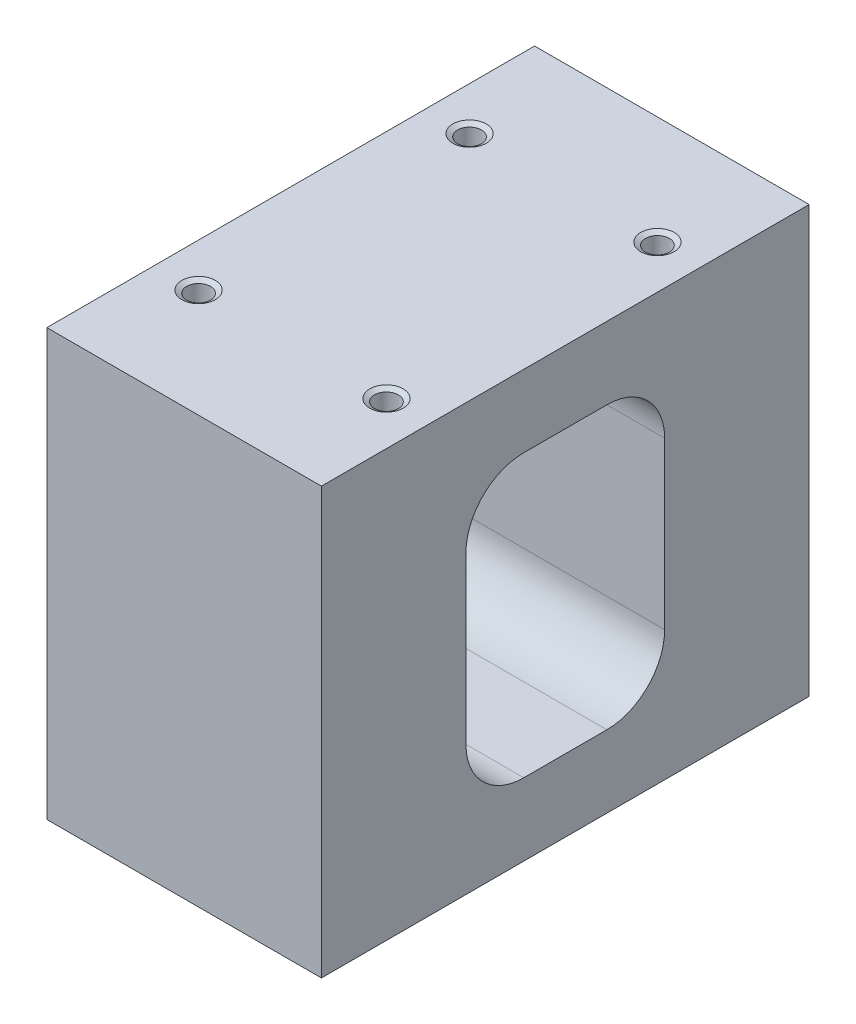
ISO-10303-21;
HEADER;
FILE_DESCRIPTION(('STEP AP214'),'2;1');
FILE_NAME('part.step','',(''),(''),'','','');
FILE_SCHEMA(('AUTOMOTIVE_DESIGN { 1 0 10303 214 1 1 1 1 }'));
ENDSEC;
DATA;
#1=APPLICATION_CONTEXT('core data for automotive mechanical design processes');
#2=APPLICATION_PROTOCOL_DEFINITION('international standard','automotive_design',2000,#1);
#3=PRODUCT_CONTEXT('',#1,'mechanical');
#4=PRODUCT('Part','Part','',(#3));
#5=PRODUCT_RELATED_PRODUCT_CATEGORY('part','',(#4));
#6=PRODUCT_DEFINITION_FORMATION('','',#4);
#7=PRODUCT_DEFINITION_CONTEXT('part definition',#1,'design');
#8=PRODUCT_DEFINITION('design','',#6,#7);
#9=PRODUCT_DEFINITION_SHAPE('','',#8);
#10=(LENGTH_UNIT() NAMED_UNIT(*) SI_UNIT(.MILLI.,.METRE.));
#11=(NAMED_UNIT(*) PLANE_ANGLE_UNIT() SI_UNIT($,.RADIAN.));
#12=(NAMED_UNIT(*) SI_UNIT($,.STERADIAN.) SOLID_ANGLE_UNIT());
#13=UNCERTAINTY_MEASURE_WITH_UNIT(LENGTH_MEASURE(1.E-05),#10,'distance_accuracy_value','');
#14=(GEOMETRIC_REPRESENTATION_CONTEXT(3) GLOBAL_UNCERTAINTY_ASSIGNED_CONTEXT((#13)) GLOBAL_UNIT_ASSIGNED_CONTEXT((#10,
#11,#12)) REPRESENTATION_CONTEXT('',''));
#15=CARTESIAN_POINT('',(0.,0.,0.));
#16=DIRECTION('',(0.,0.,1.));
#17=DIRECTION('',(1.,0.,0.));
#18=AXIS2_PLACEMENT_3D('',#15,#16,#17);
#19=CARTESIAN_POINT('',(228.51065,-329.239072168889,-602.3375));
#20=DIRECTION('',(0.,1.,0.));
#21=DIRECTION('',(0.,0.,1.));
#22=AXIS2_PLACEMENT_3D('',#19,#20,#21);
#23=CONICAL_SURFACE('',#22,1.64999999990248,1.02974425868107);
#24=CARTESIAN_POINT('',(228.51064999989,-330.230492190253,-602.3375));
#25=VERTEX_POINT('',#24);
#26=VERTEX_LOOP('',#25);
#27=FACE_BOUND('',#26,.T.);
#28=CARTESIAN_POINT('',(228.51065,-329.239072168843,-602.3375));
#29=DIRECTION('',(0.,1.,0.));
#30=DIRECTION('',(0.,0.,1.));
#31=AXIS2_PLACEMENT_3D('',#28,#29,#30);
#32=CIRCLE('',#31,1.65);
#33=CARTESIAN_POINT('',(228.51065,-329.239072168843,-600.6875));
#34=VERTEX_POINT('',#33);
#35=EDGE_CURVE('E233',#34,#34,#32,.T.);
#36=ORIENTED_EDGE('',*,*,#35,.T.);
#37=EDGE_LOOP('',(#36));
#38=FACE_BOUND('',#37,.T.);
#39=ADVANCED_FACE('F17',(#27,#38),#23,.F.);
#40=CARTESIAN_POINT('',(254.510652388512,-329.239072168832,-639.8375));
#41=DIRECTION('',(0.,1.,0.));
#42=DIRECTION('',(0.,0.,1.));
#43=AXIS2_PLACEMENT_3D('',#40,#41,#42);
#44=CONICAL_SURFACE('',#43,1.65000000001825,1.02974425864892);
#45=CARTESIAN_POINT('',(254.510652388518,-330.230492190196,-639.8375));
#46=VERTEX_POINT('',#45);
#47=VERTEX_LOOP('',#46);
#48=FACE_BOUND('',#47,.T.);
#49=CARTESIAN_POINT('',(254.510652388512,-329.239072168843,-639.8375));
#50=DIRECTION('',(0.,1.,0.));
#51=DIRECTION('',(0.,0.,1.));
#52=AXIS2_PLACEMENT_3D('',#49,#50,#51);
#53=CIRCLE('',#52,1.65);
#54=CARTESIAN_POINT('',(254.510652388512,-329.239072168843,-638.1875));
#55=VERTEX_POINT('',#54);
#56=EDGE_CURVE('E229',#55,#55,#53,.T.);
#57=ORIENTED_EDGE('',*,*,#56,.T.);
#58=EDGE_LOOP('',(#57));
#59=FACE_BOUND('',#58,.T.);
#60=ADVANCED_FACE('F521',(#48,#59),#44,.F.);
#61=CARTESIAN_POINT('',(254.51065,-329.239072168832,-602.3375));
#62=DIRECTION('',(0.,1.,0.));
#63=DIRECTION('',(0.,0.,1.));
#64=AXIS2_PLACEMENT_3D('',#61,#62,#63);
#65=CONICAL_SURFACE('',#64,1.65000000008347,1.02974425870138);
#66=CARTESIAN_POINT('',(254.510649999929,-330.230492190225,-602.3375));
#67=VERTEX_POINT('',#66);
#68=VERTEX_LOOP('',#67);
#69=FACE_BOUND('',#68,.T.);
#70=CARTESIAN_POINT('',(254.51065,-329.239072168843,-602.3375));
#71=DIRECTION('',(0.,1.,0.));
#72=DIRECTION('',(0.,0.,1.));
#73=AXIS2_PLACEMENT_3D('',#70,#71,#72);
#74=CIRCLE('',#73,1.65);
#75=CARTESIAN_POINT('',(254.51065,-329.239072168843,-600.6875));
#76=VERTEX_POINT('',#75);
#77=EDGE_CURVE('E225',#76,#76,#74,.T.);
#78=ORIENTED_EDGE('',*,*,#77,.T.);
#79=EDGE_LOOP('',(#78));
#80=FACE_BOUND('',#79,.T.);
#81=ADVANCED_FACE('F518',(#69,#80),#65,.F.);
#82=CARTESIAN_POINT('',(228.510652388512,-329.239072168889,-639.8375));
#83=DIRECTION('',(0.,1.,0.));
#84=DIRECTION('',(0.,0.,1.));
#85=AXIS2_PLACEMENT_3D('',#82,#83,#84);
#86=CONICAL_SURFACE('',#85,1.64999999995094,1.02974425857238);
#87=CARTESIAN_POINT('',(228.510652388394,-330.23049219031,-639.8375));
#88=VERTEX_POINT('',#87);
#89=VERTEX_LOOP('',#88);
#90=FACE_BOUND('',#89,.T.);
#91=CARTESIAN_POINT('',(228.510652388512,-329.239072168843,-639.8375));
#92=DIRECTION('',(0.,1.,0.));
#93=DIRECTION('',(0.,0.,1.));
#94=AXIS2_PLACEMENT_3D('',#91,#92,#93);
#95=CIRCLE('',#94,1.65);
#96=CARTESIAN_POINT('',(228.510652388512,-329.239072168843,-638.1875));
#97=VERTEX_POINT('',#96);
#98=EDGE_CURVE('E221',#97,#97,#95,.T.);
#99=ORIENTED_EDGE('',*,*,#98,.T.);
#100=EDGE_LOOP('',(#99));
#101=FACE_BOUND('',#100,.T.);
#102=ADVANCED_FACE('F514',(#90,#101),#86,.F.);
#103=CARTESIAN_POINT('',(228.510652388512,-363.7890721688,-602.3375));
#104=DIRECTION('',(0.,-1.,0.));
#105=DIRECTION('',(0.,0.,-1.));
#106=AXIS2_PLACEMENT_3D('',#103,#104,#105);
#107=CONICAL_SURFACE('',#106,1.64999999984597,1.02974425857194);
#108=CARTESIAN_POINT('',(228.510652388621,-362.797652147435,-602.3375));
#109=VERTEX_POINT('',#108);
#110=VERTEX_LOOP('',#109);
#111=FACE_BOUND('',#110,.T.);
#112=CARTESIAN_POINT('',(228.510652388512,-363.789072168843,-602.3375));
#113=DIRECTION('',(0.,-1.,0.));
#114=DIRECTION('',(0.,0.,-1.));
#115=AXIS2_PLACEMENT_3D('',#112,#113,#114);
#116=CIRCLE('',#115,1.65);
#117=CARTESIAN_POINT('',(228.510652388512,-363.789072168843,-603.9875));
#118=VERTEX_POINT('',#117);
#119=EDGE_CURVE('E217',#118,#118,#116,.T.);
#120=ORIENTED_EDGE('',*,*,#119,.T.);
#121=EDGE_LOOP('',(#120));
#122=FACE_BOUND('',#121,.T.);
#123=ADVANCED_FACE('F507',(#111,#122),#107,.F.);
#124=CARTESIAN_POINT('',(228.510652388512,-363.7890721688,-639.8375));
#125=DIRECTION('',(0.,-1.,0.));
#126=DIRECTION('',(0.,0.,-1.));
#127=AXIS2_PLACEMENT_3D('',#124,#125,#126);
#128=CONICAL_SURFACE('',#127,1.64999999984597,1.02974425857194);
#129=CARTESIAN_POINT('',(228.510652388621,-362.797652147435,-639.8375));
#130=VERTEX_POINT('',#129);
#131=VERTEX_LOOP('',#130);
#132=FACE_BOUND('',#131,.T.);
#133=CARTESIAN_POINT('',(228.510652388512,-363.789072168843,-639.8375));
#134=DIRECTION('',(0.,-1.,0.));
#135=DIRECTION('',(0.,0.,-1.));
#136=AXIS2_PLACEMENT_3D('',#133,#134,#135);
#137=CIRCLE('',#136,1.65);
#138=CARTESIAN_POINT('',(228.510652388512,-363.789072168843,-641.4875));
#139=VERTEX_POINT('',#138);
#140=EDGE_CURVE('E213',#139,#139,#137,.T.);
#141=ORIENTED_EDGE('',*,*,#140,.T.);
#142=EDGE_LOOP('',(#141));
#143=FACE_BOUND('',#142,.T.);
#144=ADVANCED_FACE('F498',(#132,#143),#128,.F.);
#145=CARTESIAN_POINT('',(254.510652388512,-363.789072168856,-602.3375));
#146=DIRECTION('',(0.,-1.,0.));
#147=DIRECTION('',(0.,0.,-1.));
#148=AXIS2_PLACEMENT_3D('',#145,#146,#147);
#149=CONICAL_SURFACE('',#148,1.64999999994919,1.02974425865575);
#150=CARTESIAN_POINT('',(254.510652388575,-362.797652147464,-602.3375));
#151=VERTEX_POINT('',#150);
#152=VERTEX_LOOP('',#151);
#153=FACE_BOUND('',#152,.T.);
#154=CARTESIAN_POINT('',(254.510652388512,-363.789072168843,-602.3375));
#155=DIRECTION('',(0.,-1.,0.));
#156=DIRECTION('',(0.,0.,-1.));
#157=AXIS2_PLACEMENT_3D('',#154,#155,#156);
#158=CIRCLE('',#157,1.65);
#159=CARTESIAN_POINT('',(254.510652388512,-363.789072168843,-603.9875));
#160=VERTEX_POINT('',#159);
#161=EDGE_CURVE('E209',#160,#160,#158,.T.);
#162=ORIENTED_EDGE('',*,*,#161,.T.);
#163=EDGE_LOOP('',(#162));
#164=FACE_BOUND('',#163,.T.);
#165=ADVANCED_FACE('F495',(#153,#164),#149,.F.);
#166=CARTESIAN_POINT('',(254.510652388512,-363.789072168856,-639.8375));
#167=DIRECTION('',(0.,-1.,0.));
#168=DIRECTION('',(0.,0.,-1.));
#169=AXIS2_PLACEMENT_3D('',#166,#167,#168);
#170=CONICAL_SURFACE('',#169,1.64999999994919,1.02974425865575);
#171=CARTESIAN_POINT('',(254.510652388575,-362.797652147464,-639.8375));
#172=VERTEX_POINT('',#171);
#173=VERTEX_LOOP('',#172);
#174=FACE_BOUND('',#173,.T.);
#175=CARTESIAN_POINT('',(254.510652388512,-363.789072168843,-639.8375));
#176=DIRECTION('',(0.,-1.,0.));
#177=DIRECTION('',(0.,0.,-1.));
#178=AXIS2_PLACEMENT_3D('',#175,#176,#177);
#179=CIRCLE('',#178,1.65);
#180=CARTESIAN_POINT('',(254.510652388512,-363.789072168843,-641.4875));
#181=VERTEX_POINT('',#180);
#182=EDGE_CURVE('E205',#181,#181,#179,.T.);
#183=ORIENTED_EDGE('',*,*,#182,.T.);
#184=EDGE_LOOP('',(#183));
#185=FACE_BOUND('',#184,.T.);
#186=ADVANCED_FACE('F497',(#174,#185),#170,.F.);
#187=CARTESIAN_POINT('',(228.51065,-317.039072168843,-602.3375));
#188=DIRECTION('',(0.,1.,0.));
#189=DIRECTION('',(0.,0.,1.));
#190=AXIS2_PLACEMENT_3D('',#187,#188,#189);
#191=CYLINDRICAL_SURFACE('',#190,1.65);
#192=ORIENTED_EDGE('',*,*,#35,.F.);
#193=EDGE_LOOP('',(#192));
#194=FACE_BOUND('',#193,.T.);
#195=CARTESIAN_POINT('',(228.51065,-317.423010097855,-602.3375));
#196=DIRECTION('',(0.,1.,0.));
#197=DIRECTION('',(1.,0.,0.));
#198=AXIS2_PLACEMENT_3D('',#195,#196,#197);
#199=CIRCLE('',#198,1.64999999995932);
#200=CARTESIAN_POINT('',(230.160649999959,-317.423010097855,-602.3375));
#201=VERTEX_POINT('',#200);
#202=EDGE_CURVE('E201',#201,#201,#199,.T.);
#203=ORIENTED_EDGE('',*,*,#202,.T.);
#204=EDGE_LOOP('',(#203));
#205=FACE_BOUND('',#204,.T.);
#206=ADVANCED_FACE('F504',(#194,#205),#191,.F.);
#207=CARTESIAN_POINT('',(254.510652388512,-317.039072168843,-639.8375));
#208=DIRECTION('',(0.,1.,0.));
#209=DIRECTION('',(0.,0.,1.));
#210=AXIS2_PLACEMENT_3D('',#207,#208,#209);
#211=CYLINDRICAL_SURFACE('',#210,1.65);
#212=ORIENTED_EDGE('',*,*,#56,.F.);
#213=EDGE_LOOP('',(#212));
#214=FACE_BOUND('',#213,.T.);
#215=CARTESIAN_POINT('',(254.510652388512,-317.423010097912,-639.8375));
#216=DIRECTION('',(0.,1.,0.));
#217=DIRECTION('',(1.,0.,0.));
#218=AXIS2_PLACEMENT_3D('',#215,#216,#217);
#219=CIRCLE('',#218,1.65000000001825);
#220=CARTESIAN_POINT('',(256.16065238853,-317.423010097912,-639.8375));
#221=VERTEX_POINT('',#220);
#222=EDGE_CURVE('E198',#221,#221,#219,.T.);
#223=ORIENTED_EDGE('',*,*,#222,.T.);
#224=EDGE_LOOP('',(#223));
#225=FACE_BOUND('',#224,.T.);
#226=ADVANCED_FACE('F531',(#214,#225),#211,.F.);
#227=CARTESIAN_POINT('',(254.51065,-317.039072168843,-602.3375));
#228=DIRECTION('',(0.,1.,0.));
#229=DIRECTION('',(0.,0.,1.));
#230=AXIS2_PLACEMENT_3D('',#227,#228,#229);
#231=CYLINDRICAL_SURFACE('',#230,1.65);
#232=ORIENTED_EDGE('',*,*,#77,.F.);
#233=EDGE_LOOP('',(#232));
#234=FACE_BOUND('',#233,.T.);
#235=CARTESIAN_POINT('',(254.51065,-317.423010097912,-602.3375));
#236=DIRECTION('',(0.,1.,0.));
#237=DIRECTION('',(1.,0.,0.));
#238=AXIS2_PLACEMENT_3D('',#235,#236,#237);
#239=CIRCLE('',#238,1.64999999996979);
#240=CARTESIAN_POINT('',(256.16064999997,-317.423010097912,-602.3375));
#241=VERTEX_POINT('',#240);
#242=EDGE_CURVE('E194',#241,#241,#239,.T.);
#243=ORIENTED_EDGE('',*,*,#242,.T.);
#244=EDGE_LOOP('',(#243));
#245=FACE_BOUND('',#244,.T.);
#246=ADVANCED_FACE('F419',(#234,#245),#231,.F.);
#247=CARTESIAN_POINT('',(228.510652388512,-317.039072168843,-639.8375));
#248=DIRECTION('',(0.,1.,0.));
#249=DIRECTION('',(0.,0.,1.));
#250=AXIS2_PLACEMENT_3D('',#247,#248,#249);
#251=CYLINDRICAL_SURFACE('',#250,1.65);
#252=ORIENTED_EDGE('',*,*,#98,.F.);
#253=EDGE_LOOP('',(#252));
#254=FACE_BOUND('',#253,.T.);
#255=CARTESIAN_POINT('',(228.510652388512,-317.423010097855,-639.8375));
#256=DIRECTION('',(0.,1.,0.));
#257=DIRECTION('',(1.,0.,0.));
#258=AXIS2_PLACEMENT_3D('',#255,#256,#257);
#259=CIRCLE('',#258,1.65000000000778);
#260=CARTESIAN_POINT('',(230.16065238852,-317.423010097855,-639.8375));
#261=VERTEX_POINT('',#260);
#262=EDGE_CURVE('E190',#261,#261,#259,.T.);
#263=ORIENTED_EDGE('',*,*,#262,.T.);
#264=EDGE_LOOP('',(#263));
#265=FACE_BOUND('',#264,.T.);
#266=ADVANCED_FACE('F409',(#254,#265),#251,.F.);
#267=CARTESIAN_POINT('',(228.510652388512,-375.989072168843,-602.3375));
#268=DIRECTION('',(0.,-1.,0.));
#269=DIRECTION('',(0.,0.,-1.));
#270=AXIS2_PLACEMENT_3D('',#267,#268,#269);
#271=CYLINDRICAL_SURFACE('',#270,1.65);
#272=ORIENTED_EDGE('',*,*,#119,.F.);
#273=EDGE_LOOP('',(#272));
#274=FACE_BOUND('',#273,.T.);
#275=CARTESIAN_POINT('',(228.510652388512,-375.605134239834,-602.3375));
#276=DIRECTION('',(0.,-1.,0.));
#277=DIRECTION('',(-1.,0.,0.));
#278=AXIS2_PLACEMENT_3D('',#275,#276,#277);
#279=CIRCLE('',#278,1.6500000000165);
#280=CARTESIAN_POINT('',(226.860652388496,-375.605134239834,-602.3375));
#281=VERTEX_POINT('',#280);
#282=EDGE_CURVE('E186',#281,#281,#279,.T.);
#283=ORIENTED_EDGE('',*,*,#282,.T.);
#284=EDGE_LOOP('',(#283));
#285=FACE_BOUND('',#284,.T.);
#286=ADVANCED_FACE('F406',(#274,#285),#271,.F.);
#287=CARTESIAN_POINT('',(228.510652388512,-375.989072168843,-639.8375));
#288=DIRECTION('',(0.,-1.,0.));
#289=DIRECTION('',(0.,0.,-1.));
#290=AXIS2_PLACEMENT_3D('',#287,#288,#289);
#291=CYLINDRICAL_SURFACE('',#290,1.65);
#292=ORIENTED_EDGE('',*,*,#140,.F.);
#293=EDGE_LOOP('',(#292));
#294=FACE_BOUND('',#293,.T.);
#295=CARTESIAN_POINT('',(228.510652388512,-375.605134239834,-639.8375));
#296=DIRECTION('',(0.,-1.,0.));
#297=DIRECTION('',(-1.,0.,0.));
#298=AXIS2_PLACEMENT_3D('',#295,#296,#297);
#299=CIRCLE('',#298,1.6500000000165);
#300=CARTESIAN_POINT('',(226.860652388496,-375.605134239834,-639.8375));
#301=VERTEX_POINT('',#300);
#302=EDGE_CURVE('E182',#301,#301,#299,.T.);
#303=ORIENTED_EDGE('',*,*,#302,.T.);
#304=EDGE_LOOP('',(#303));
#305=FACE_BOUND('',#304,.T.);
#306=ADVANCED_FACE('F408',(#294,#305),#291,.F.);
#307=CARTESIAN_POINT('',(254.510652388512,-375.989072168843,-602.3375));
#308=DIRECTION('',(0.,-1.,0.));
#309=DIRECTION('',(0.,0.,-1.));
#310=AXIS2_PLACEMENT_3D('',#307,#308,#309);
#311=CYLINDRICAL_SURFACE('',#310,1.65);
#312=ORIENTED_EDGE('',*,*,#161,.F.);
#313=EDGE_LOOP('',(#312));
#314=FACE_BOUND('',#313,.T.);
#315=CARTESIAN_POINT('',(254.510652388512,-375.605134239834,-602.3375));
#316=DIRECTION('',(0.,-1.,0.));
#317=DIRECTION('',(-1.,0.,0.));
#318=AXIS2_PLACEMENT_3D('',#315,#316,#317);
#319=CIRCLE('',#318,1.65000000006288);
#320=CARTESIAN_POINT('',(252.860652388449,-375.605134239834,-602.3375));
#321=VERTEX_POINT('',#320);
#322=EDGE_CURVE('E178',#321,#321,#319,.T.);
#323=ORIENTED_EDGE('',*,*,#322,.T.);
#324=EDGE_LOOP('',(#323));
#325=FACE_BOUND('',#324,.T.);
#326=ADVANCED_FACE('F416',(#314,#325),#311,.F.);
#327=CARTESIAN_POINT('',(254.510652388512,-375.989072168843,-639.8375));
#328=DIRECTION('',(0.,-1.,0.));
#329=DIRECTION('',(0.,0.,-1.));
#330=AXIS2_PLACEMENT_3D('',#327,#328,#329);
#331=CYLINDRICAL_SURFACE('',#330,1.65);
#332=ORIENTED_EDGE('',*,*,#182,.F.);
#333=EDGE_LOOP('',(#332));
#334=FACE_BOUND('',#333,.T.);
#335=CARTESIAN_POINT('',(254.510652388512,-375.605134239834,-639.8375));
#336=DIRECTION('',(0.,-1.,0.));
#337=DIRECTION('',(-1.,0.,0.));
#338=AXIS2_PLACEMENT_3D('',#335,#336,#337);
#339=CIRCLE('',#338,1.65000000006288);
#340=CARTESIAN_POINT('',(252.860652388449,-375.605134239834,-639.8375));
#341=VERTEX_POINT('',#340);
#342=EDGE_CURVE('E147',#341,#341,#339,.T.);
#343=ORIENTED_EDGE('',*,*,#342,.T.);
#344=EDGE_LOOP('',(#343));
#345=FACE_BOUND('',#344,.T.);
#346=ADVANCED_FACE('F482',(#334,#345),#331,.F.);
#347=CARTESIAN_POINT('',(228.51065,-317.039072168882,-602.3375));
#348=DIRECTION('',(0.,1.,0.));
#349=DIRECTION('',(0.,0.,1.));
#350=AXIS2_PLACEMENT_3D('',#347,#348,#349);
#351=CONICAL_SURFACE('',#350,2.31499999987197,1.04719755119266);
#352=CARTESIAN_POINT('',(228.51065,-317.039072168802,-602.3375));
#353=DIRECTION('',(0.,1.,0.));
#354=DIRECTION('',(0.,0.,1.));
#355=AXIS2_PLACEMENT_3D('',#352,#353,#354);
#356=CIRCLE('',#355,2.31500000001006);
#357=CARTESIAN_POINT('',(228.51065,-317.039072168802,-600.02249999999));
#358=VERTEX_POINT('',#357);
#359=EDGE_CURVE('E287',#358,#358,#356,.T.);
#360=ORIENTED_EDGE('',*,*,#359,.T.);
#361=EDGE_LOOP('',(#360));
#362=FACE_BOUND('',#361,.T.);
#363=ORIENTED_EDGE('',*,*,#202,.F.);
#364=EDGE_LOOP('',(#363));
#365=FACE_BOUND('',#364,.T.);
#366=ADVANCED_FACE('F478',(#362,#365),#351,.F.);
#367=CARTESIAN_POINT('',(254.510652388512,-317.039072168882,-639.8375));
#368=DIRECTION('',(0.,1.,0.));
#369=DIRECTION('',(0.,0.,1.));
#370=AXIS2_PLACEMENT_3D('',#367,#368,#369);
#371=CONICAL_SURFACE('',#370,2.31500000004459,1.04719755119266);
#372=CARTESIAN_POINT('',(254.510652388512,-317.039072168869,-639.8375));
#373=DIRECTION('',(0.,1.,0.));
#374=DIRECTION('',(0.,0.,1.));
#375=AXIS2_PLACEMENT_3D('',#372,#373,#374);
#376=CIRCLE('',#375,2.3150000000669);
#377=CARTESIAN_POINT('',(254.510652388512,-317.039072168869,-637.522499999933));
#378=VERTEX_POINT('',#377);
#379=EDGE_CURVE('E283',#378,#378,#376,.T.);
#380=ORIENTED_EDGE('',*,*,#379,.T.);
#381=EDGE_LOOP('',(#380));
#382=FACE_BOUND('',#381,.T.);
#383=ORIENTED_EDGE('',*,*,#222,.F.);
#384=EDGE_LOOP('',(#383));
#385=FACE_BOUND('',#384,.T.);
#386=ADVANCED_FACE('F474',(#382,#385),#371,.F.);
#387=CARTESIAN_POINT('',(254.51065,-317.039072168882,-602.3375));
#388=DIRECTION('',(0.,1.,0.));
#389=DIRECTION('',(0.,0.,1.));
#390=AXIS2_PLACEMENT_3D('',#387,#388,#389);
#391=CONICAL_SURFACE('',#390,2.31499999999613,1.04719755119266);
#392=CARTESIAN_POINT('',(254.51065,-317.039072168874,-602.3375));
#393=DIRECTION('',(0.,1.,0.));
#394=DIRECTION('',(0.,0.,1.));
#395=AXIS2_PLACEMENT_3D('',#392,#393,#394);
#396=CIRCLE('',#395,2.31500000001006);
#397=CARTESIAN_POINT('',(254.51065,-317.039072168874,-600.02249999999));
#398=VERTEX_POINT('',#397);
#399=EDGE_CURVE('E279',#398,#398,#396,.T.);
#400=ORIENTED_EDGE('',*,*,#399,.T.);
#401=EDGE_LOOP('',(#400));
#402=FACE_BOUND('',#401,.T.);
#403=ORIENTED_EDGE('',*,*,#242,.F.);
#404=EDGE_LOOP('',(#403));
#405=FACE_BOUND('',#404,.T.);
#406=ADVANCED_FACE('F470',(#402,#405),#391,.F.);
#407=CARTESIAN_POINT('',(228.510652388512,-317.039072168882,-639.8375));
#408=DIRECTION('',(0.,1.,0.));
#409=DIRECTION('',(0.,0.,1.));
#410=AXIS2_PLACEMENT_3D('',#407,#408,#409);
#411=CONICAL_SURFACE('',#410,2.31499999997728,1.04719755119266);
#412=CARTESIAN_POINT('',(228.510652388512,-317.03907216883,-639.8375));
#413=DIRECTION('',(0.,1.,0.));
#414=DIRECTION('',(0.,0.,1.));
#415=AXIS2_PLACEMENT_3D('',#412,#413,#414);
#416=CIRCLE('',#415,2.3150000000669);
#417=CARTESIAN_POINT('',(228.510652388512,-317.03907216883,-637.522499999933));
#418=VERTEX_POINT('',#417);
#419=EDGE_CURVE('E274',#418,#418,#416,.T.);
#420=ORIENTED_EDGE('',*,*,#419,.T.);
#421=EDGE_LOOP('',(#420));
#422=FACE_BOUND('',#421,.T.);
#423=ORIENTED_EDGE('',*,*,#262,.F.);
#424=EDGE_LOOP('',(#423));
#425=FACE_BOUND('',#424,.T.);
#426=ADVANCED_FACE('F402',(#422,#425),#411,.F.);
#427=CARTESIAN_POINT('',(228.510652388512,-375.98907216875,-602.3375));
#428=DIRECTION('',(0.,-1.,0.));
#429=DIRECTION('',(0.,0.,-1.));
#430=AXIS2_PLACEMENT_3D('',#427,#428,#429);
#431=CONICAL_SURFACE('',#430,2.31499999987231,1.04719755121976);
#432=CARTESIAN_POINT('',(228.510652388512,-375.989072168796,-602.3375));
#433=DIRECTION('',(0.,-1.,0.));
#434=DIRECTION('',(0.,0.,-1.));
#435=AXIS2_PLACEMENT_3D('',#432,#433,#434);
#436=CIRCLE('',#435,2.31499999995322);
#437=CARTESIAN_POINT('',(228.510652388512,-375.989072168796,-604.652499999953));
#438=VERTEX_POINT('',#437);
#439=EDGE_CURVE('E269',#438,#438,#436,.T.);
#440=ORIENTED_EDGE('',*,*,#439,.T.);
#441=EDGE_LOOP('',(#440));
#442=FACE_BOUND('',#441,.T.);
#443=ORIENTED_EDGE('',*,*,#282,.F.);
#444=EDGE_LOOP('',(#443));
#445=FACE_BOUND('',#444,.T.);
#446=ADVANCED_FACE('F398',(#442,#445),#431,.F.);
#447=CARTESIAN_POINT('',(228.510652388512,-375.98907216875,-639.8375));
#448=DIRECTION('',(0.,-1.,0.));
#449=DIRECTION('',(0.,0.,-1.));
#450=AXIS2_PLACEMENT_3D('',#447,#448,#449);
#451=CONICAL_SURFACE('',#450,2.31499999987231,1.04719755121976);
#452=CARTESIAN_POINT('',(228.510652388512,-375.989072168796,-639.8375));
#453=DIRECTION('',(0.,-1.,0.));
#454=DIRECTION('',(0.,0.,-1.));
#455=AXIS2_PLACEMENT_3D('',#452,#453,#454);
#456=CIRCLE('',#455,2.31499999995322);
#457=CARTESIAN_POINT('',(228.510652388512,-375.989072168796,-642.152499999953));
#458=VERTEX_POINT('',#457);
#459=EDGE_CURVE('E265',#458,#458,#456,.T.);
#460=ORIENTED_EDGE('',*,*,#459,.T.);
#461=EDGE_LOOP('',(#460));
#462=FACE_BOUND('',#461,.T.);
#463=ORIENTED_EDGE('',*,*,#302,.F.);
#464=EDGE_LOOP('',(#463));
#465=FACE_BOUND('',#464,.T.);
#466=ADVANCED_FACE('F401',(#462,#465),#451,.F.);
#467=CARTESIAN_POINT('',(254.510652388512,-375.989072168807,-602.3375));
#468=DIRECTION('',(0.,-1.,0.));
#469=DIRECTION('',(0.,0.,-1.));
#470=AXIS2_PLACEMENT_3D('',#467,#468,#469);
#471=CONICAL_SURFACE('',#470,2.31499999997553,1.04719755118274);
#472=CARTESIAN_POINT('',(254.510652388512,-375.989072168794,-602.3375));
#473=DIRECTION('',(0.,-1.,0.));
#474=DIRECTION('',(0.,0.,-1.));
#475=AXIS2_PLACEMENT_3D('',#472,#473,#474);
#476=CIRCLE('',#475,2.31499999995322);
#477=CARTESIAN_POINT('',(254.510652388512,-375.989072168794,-604.652499999953));
#478=VERTEX_POINT('',#477);
#479=EDGE_CURVE('E261',#478,#478,#476,.T.);
#480=ORIENTED_EDGE('',*,*,#479,.T.);
#481=EDGE_LOOP('',(#480));
#482=FACE_BOUND('',#481,.T.);
#483=ORIENTED_EDGE('',*,*,#322,.F.);
#484=EDGE_LOOP('',(#483));
#485=FACE_BOUND('',#484,.T.);
#486=ADVANCED_FACE('F460',(#482,#485),#471,.F.);
#487=CARTESIAN_POINT('',(254.510652388512,-375.989072168807,-639.8375));
#488=DIRECTION('',(0.,-1.,0.));
#489=DIRECTION('',(0.,0.,-1.));
#490=AXIS2_PLACEMENT_3D('',#487,#488,#489);
#491=CONICAL_SURFACE('',#490,2.31499999997553,1.04719755118274);
#492=CARTESIAN_POINT('',(254.510652388512,-375.989072168794,-639.8375));
#493=DIRECTION('',(0.,-1.,0.));
#494=DIRECTION('',(0.,0.,-1.));
#495=AXIS2_PLACEMENT_3D('',#492,#493,#494);
#496=CIRCLE('',#495,2.31499999995322);
#497=CARTESIAN_POINT('',(254.510652388512,-375.989072168794,-642.152499999953));
#498=VERTEX_POINT('',#497);
#499=EDGE_CURVE('E256',#498,#498,#496,.T.);
#500=ORIENTED_EDGE('',*,*,#499,.T.);
#501=EDGE_LOOP('',(#500));
#502=FACE_BOUND('',#501,.T.);
#503=ORIENTED_EDGE('',*,*,#342,.F.);
#504=EDGE_LOOP('',(#503));
#505=FACE_BOUND('',#504,.T.);
#506=ADVANCED_FACE('F457',(#502,#505),#491,.F.);
#507=CARTESIAN_POINT('',(260.510652388512,-414.989072168843,-634.8375));
#508=DIRECTION('',(-1.,0.,0.));
#509=DIRECTION('',(0.,0.,1.));
#510=AXIS2_PLACEMENT_3D('',#507,#508,#509);
#511=PLANE('',#510);
#512=DIRECTION('',(0.,1.,0.));
#513=VECTOR('',#512,1.);
#514=CARTESIAN_POINT('',(260.510652388512,-375.989072168843,-654.8375));
#515=LINE('',#514,#513);
#516=CARTESIAN_POINT('',(260.510652388512,-375.989072168843,-654.8375));
#517=VERTEX_POINT('',#516);
#518=CARTESIAN_POINT('',(260.510652388512,-317.039072168843,-654.8375));
#519=VERTEX_POINT('',#518);
#520=EDGE_CURVE('E331',#517,#519,#515,.T.);
#521=ORIENTED_EDGE('',*,*,#520,.T.);
#522=DIRECTION('',(0.,0.,-1.));
#523=VECTOR('',#522,1.);
#524=CARTESIAN_POINT('',(260.510652388512,-317.039072168843,-654.8375));
#525=LINE('',#524,#523);
#526=CARTESIAN_POINT('',(260.510652388512,-317.039072168843,-587.3375));
#527=VERTEX_POINT('',#526);
#528=EDGE_CURVE('E278',#519,#527,#525,.F.);
#529=ORIENTED_EDGE('',*,*,#528,.T.);
#530=DIRECTION('',(0.,1.,0.));
#531=VECTOR('',#530,1.);
#532=CARTESIAN_POINT('',(260.510652388512,-317.039072168843,-587.3375));
#533=LINE('',#532,#531);
#534=CARTESIAN_POINT('',(260.510652388512,-375.989072168843,-587.3375));
#535=VERTEX_POINT('',#534);
#536=EDGE_CURVE('E291',#527,#535,#533,.F.);
#537=ORIENTED_EDGE('',*,*,#536,.T.);
#538=DIRECTION('',(0.,0.,1.));
#539=VECTOR('',#538,1.);
#540=CARTESIAN_POINT('',(260.510652388512,-375.989072168843,-587.3375));
#541=LINE('',#540,#539);
#542=EDGE_CURVE('E321',#535,#517,#541,.F.);
#543=ORIENTED_EDGE('',*,*,#542,.T.);
#544=EDGE_LOOP('',(#521,#529,#537,#543));
#545=FACE_BOUND('',#544,.T.);
#546=CARTESIAN_POINT('',(260.510652388512,-357.989072168843,-626.8375));
#547=DIRECTION('',(-1.,0.,0.));
#548=DIRECTION('',(0.,0.,1.));
#549=AXIS2_PLACEMENT_3D('',#546,#547,#548);
#550=CIRCLE('',#549,8.);
#551=CARTESIAN_POINT('',(260.510652388512,-357.989072168843,-634.8375));
#552=VERTEX_POINT('',#551);
#553=CARTESIAN_POINT('',(260.510652388512,-365.989072168843,-626.8375));
#554=VERTEX_POINT('',#553);
#555=EDGE_CURVE('E168',#552,#554,#550,.T.);
#556=ORIENTED_EDGE('',*,*,#555,.T.);
#557=DIRECTION('',(0.,0.,-1.));
#558=VECTOR('',#557,1.);
#559=CARTESIAN_POINT('',(260.510652388512,-365.989072168843,-607.3375));
#560=LINE('',#559,#558);
#561=CARTESIAN_POINT('',(260.510652388512,-365.989072168843,-615.3375));
#562=VERTEX_POINT('',#561);
#563=EDGE_CURVE('E164',#554,#562,#560,.F.);
#564=ORIENTED_EDGE('',*,*,#563,.T.);
#565=CARTESIAN_POINT('',(260.510652388512,-357.989072168843,-615.3375));
#566=DIRECTION('',(1.,0.,0.));
#567=DIRECTION('',(0.,0.,-1.));
#568=AXIS2_PLACEMENT_3D('',#565,#566,#567);
#569=CIRCLE('',#568,8.);
#570=CARTESIAN_POINT('',(260.510652388512,-357.989072168843,-607.3375));
#571=VERTEX_POINT('',#570);
#572=EDGE_CURVE('E295',#562,#571,#569,.F.);
#573=ORIENTED_EDGE('',*,*,#572,.T.);
#574=DIRECTION('',(0.,1.,0.));
#575=VECTOR('',#574,1.);
#576=CARTESIAN_POINT('',(260.510652388512,-327.039072168843,-607.3375));
#577=LINE('',#576,#575);
#578=CARTESIAN_POINT('',(260.510652388512,-335.039072168843,-607.3375));
#579=VERTEX_POINT('',#578);
#580=EDGE_CURVE('E170',#571,#579,#577,.T.);
#581=ORIENTED_EDGE('',*,*,#580,.T.);
#582=CARTESIAN_POINT('',(260.510652388512,-335.039072168843,-615.3375));
#583=DIRECTION('',(-1.,0.,0.));
#584=DIRECTION('',(0.,0.,1.));
#585=AXIS2_PLACEMENT_3D('',#582,#583,#584);
#586=CIRCLE('',#585,8.);
#587=CARTESIAN_POINT('',(260.510652388512,-327.039072168843,-615.3375));
#588=VERTEX_POINT('',#587);
#589=EDGE_CURVE('E298',#579,#588,#586,.T.);
#590=ORIENTED_EDGE('',*,*,#589,.T.);
#591=DIRECTION('',(0.,0.,1.));
#592=VECTOR('',#591,1.);
#593=CARTESIAN_POINT('',(260.510652388512,-327.039072168843,-634.8375));
#594=LINE('',#593,#592);
#595=CARTESIAN_POINT('',(260.510652388512,-327.039072168843,-626.8375));
#596=VERTEX_POINT('',#595);
#597=EDGE_CURVE('E129',#588,#596,#594,.F.);
#598=ORIENTED_EDGE('',*,*,#597,.T.);
#599=CARTESIAN_POINT('',(260.510652388512,-335.039072168843,-626.8375));
#600=DIRECTION('',(-1.,0.,0.));
#601=DIRECTION('',(0.,0.,1.));
#602=AXIS2_PLACEMENT_3D('',#599,#600,#601);
#603=CIRCLE('',#602,8.);
#604=CARTESIAN_POINT('',(260.510652388512,-335.039072168843,-634.8375));
#605=VERTEX_POINT('',#604);
#606=EDGE_CURVE('E20',#596,#605,#603,.T.);
#607=ORIENTED_EDGE('',*,*,#606,.T.);
#608=DIRECTION('',(0.,1.,0.));
#609=VECTOR('',#608,1.);
#610=CARTESIAN_POINT('',(260.510652388512,-365.989072168843,-634.8375));
#611=LINE('',#610,#609);
#612=EDGE_CURVE('E133',#605,#552,#611,.F.);
#613=ORIENTED_EDGE('',*,*,#612,.T.);
#614=EDGE_LOOP('',(#556,#564,#573,#581,#590,#598,#607,#613));
#615=FACE_BOUND('',#614,.T.);
#616=ADVANCED_FACE('F132',(#545,#615),#511,.F.);
#617=CARTESIAN_POINT('',(264.324572388512,-365.989072168843,-634.8375));
#618=DIRECTION('',(0.,0.,-1.));
#619=DIRECTION('',(-1.,0.,0.));
#620=AXIS2_PLACEMENT_3D('',#617,#618,#619);
#621=PLANE('',#620);
#622=ORIENTED_EDGE('',*,*,#612,.F.);
#623=DIRECTION('',(-1.,0.,0.));
#624=VECTOR('',#623,1.);
#625=CARTESIAN_POINT('',(241.510652388512,-335.039072168843,-634.8375));
#626=LINE('',#625,#624);
#627=CARTESIAN_POINT('',(222.510652388512,-335.039072168843,-634.8375));
#628=VERTEX_POINT('',#627);
#629=EDGE_CURVE('E139',#605,#628,#626,.T.);
#630=ORIENTED_EDGE('',*,*,#629,.T.);
#631=DIRECTION('',(0.,1.,0.));
#632=VECTOR('',#631,1.);
#633=CARTESIAN_POINT('',(222.510652388512,-395.489072168843,-634.8375));
#634=LINE('',#633,#632);
#635=CARTESIAN_POINT('',(222.510652388512,-357.989072168843,-634.8375));
#636=VERTEX_POINT('',#635);
#637=EDGE_CURVE('E255',#636,#628,#634,.T.);
#638=ORIENTED_EDGE('',*,*,#637,.F.);
#639=DIRECTION('',(-1.,0.,0.));
#640=VECTOR('',#639,1.);
#641=CARTESIAN_POINT('',(241.510652388512,-357.989072168843,-634.8375));
#642=LINE('',#641,#640);
#643=EDGE_CURVE('E144',#636,#552,#642,.F.);
#644=ORIENTED_EDGE('',*,*,#643,.T.);
#645=EDGE_LOOP('',(#622,#630,#638,#644));
#646=FACE_BOUND('',#645,.T.);
#647=ADVANCED_FACE('F141',(#646),#621,.F.);
#648=CARTESIAN_POINT('',(241.510652388512,-335.039072168843,-626.8375));
#649=DIRECTION('',(-1.,0.,0.));
#650=DIRECTION('',(0.,0.,1.));
#651=AXIS2_PLACEMENT_3D('',#648,#649,#650);
#652=CYLINDRICAL_SURFACE('',#651,8.);
#653=CARTESIAN_POINT('',(222.510652388512,-335.039072168843,-626.8375));
#654=DIRECTION('',(-1.,0.,0.));
#655=DIRECTION('',(0.,0.,1.));
#656=AXIS2_PLACEMENT_3D('',#653,#654,#655);
#657=CIRCLE('',#656,8.);
#658=CARTESIAN_POINT('',(222.510652388512,-327.039072168843,-626.8375));
#659=VERTEX_POINT('',#658);
#660=EDGE_CURVE('E151',#628,#659,#657,.F.);
#661=ORIENTED_EDGE('',*,*,#660,.F.);
#662=ORIENTED_EDGE('',*,*,#629,.F.);
#663=ORIENTED_EDGE('',*,*,#606,.F.);
#664=DIRECTION('',(1.,0.,0.));
#665=VECTOR('',#664,1.);
#666=CARTESIAN_POINT('',(264.324572388512,-327.039072168843,-626.8375));
#667=LINE('',#666,#665);
#668=EDGE_CURVE('E159',#596,#659,#667,.F.);
#669=ORIENTED_EDGE('',*,*,#668,.T.);
#670=EDGE_LOOP('',(#661,#662,#663,#669));
#671=FACE_BOUND('',#670,.T.);
#672=ADVANCED_FACE('F149',(#671),#652,.F.);
#673=CARTESIAN_POINT('',(264.324572388512,-327.039072168843,-634.8375));
#674=DIRECTION('',(0.,1.,0.));
#675=DIRECTION('',(0.,0.,1.));
#676=AXIS2_PLACEMENT_3D('',#673,#674,#675);
#677=PLANE('',#676);
#678=ORIENTED_EDGE('',*,*,#597,.F.);
#679=DIRECTION('',(-1.,0.,0.));
#680=VECTOR('',#679,1.);
#681=CARTESIAN_POINT('',(241.510652388512,-327.039072168843,-615.3375));
#682=LINE('',#681,#680);
#683=CARTESIAN_POINT('',(222.510652388512,-327.039072168843,-615.3375));
#684=VERTEX_POINT('',#683);
#685=EDGE_CURVE('E173',#588,#684,#682,.T.);
#686=ORIENTED_EDGE('',*,*,#685,.T.);
#687=DIRECTION('',(0.,0.,1.));
#688=VECTOR('',#687,1.);
#689=CARTESIAN_POINT('',(222.510652388512,-327.039072168843,-592.3375));
#690=LINE('',#689,#688);
#691=EDGE_CURVE('E252',#659,#684,#690,.T.);
#692=ORIENTED_EDGE('',*,*,#691,.F.);
#693=ORIENTED_EDGE('',*,*,#668,.F.);
#694=EDGE_LOOP('',(#678,#686,#692,#693));
#695=FACE_BOUND('',#694,.T.);
#696=ADVANCED_FACE('F307',(#695),#677,.F.);
#697=CARTESIAN_POINT('',(241.510652388512,-335.039072168843,-615.3375));
#698=DIRECTION('',(-1.,0.,0.));
#699=DIRECTION('',(0.,0.,1.));
#700=AXIS2_PLACEMENT_3D('',#697,#698,#699);
#701=CYLINDRICAL_SURFACE('',#700,8.);
#702=CARTESIAN_POINT('',(222.510652388512,-335.039072168843,-615.3375));
#703=DIRECTION('',(-1.,0.,0.));
#704=DIRECTION('',(0.,0.,1.));
#705=AXIS2_PLACEMENT_3D('',#702,#703,#704);
#706=CIRCLE('',#705,8.);
#707=CARTESIAN_POINT('',(222.510652388512,-335.039072168843,-607.3375));
#708=VERTEX_POINT('',#707);
#709=EDGE_CURVE('E248',#684,#708,#706,.F.);
#710=ORIENTED_EDGE('',*,*,#709,.F.);
#711=ORIENTED_EDGE('',*,*,#685,.F.);
#712=ORIENTED_EDGE('',*,*,#589,.F.);
#713=DIRECTION('',(1.,0.,0.));
#714=VECTOR('',#713,1.);
#715=CARTESIAN_POINT('',(264.324572388512,-335.039072168843,-607.3375));
#716=LINE('',#715,#714);
#717=EDGE_CURVE('E172',#579,#708,#716,.F.);
#718=ORIENTED_EDGE('',*,*,#717,.T.);
#719=EDGE_LOOP('',(#710,#711,#712,#718));
#720=FACE_BOUND('',#719,.T.);
#721=ADVANCED_FACE('F350',(#720),#701,.F.);
#722=CARTESIAN_POINT('',(264.324572388512,-327.039072168843,-607.3375));
#723=DIRECTION('',(0.,0.,1.));
#724=DIRECTION('',(1.,0.,0.));
#725=AXIS2_PLACEMENT_3D('',#722,#723,#724);
#726=PLANE('',#725);
#727=DIRECTION('',(0.,1.,0.));
#728=VECTOR('',#727,1.);
#729=CARTESIAN_POINT('',(222.510652388512,-395.489072168843,-607.3375));
#730=LINE('',#729,#728);
#731=CARTESIAN_POINT('',(222.510652388512,-357.989072168843,-607.3375));
#732=VERTEX_POINT('',#731);
#733=EDGE_CURVE('E247',#708,#732,#730,.F.);
#734=ORIENTED_EDGE('',*,*,#733,.F.);
#735=ORIENTED_EDGE('',*,*,#717,.F.);
#736=ORIENTED_EDGE('',*,*,#580,.F.);
#737=DIRECTION('',(1.,0.,0.));
#738=VECTOR('',#737,1.);
#739=CARTESIAN_POINT('',(241.510652388512,-357.989072168843,-607.3375));
#740=LINE('',#739,#738);
#741=EDGE_CURVE('E297',#571,#732,#740,.F.);
#742=ORIENTED_EDGE('',*,*,#741,.T.);
#743=EDGE_LOOP('',(#734,#735,#736,#742));
#744=FACE_BOUND('',#743,.T.);
#745=ADVANCED_FACE('F354',(#744),#726,.F.);
#746=CARTESIAN_POINT('',(241.510652388512,-357.989072168843,-615.3375));
#747=DIRECTION('',(1.,0.,0.));
#748=DIRECTION('',(0.,0.,-1.));
#749=AXIS2_PLACEMENT_3D('',#746,#747,#748);
#750=CYLINDRICAL_SURFACE('',#749,8.);
#751=ORIENTED_EDGE('',*,*,#572,.F.);
#752=DIRECTION('',(1.,0.,0.));
#753=VECTOR('',#752,1.);
#754=CARTESIAN_POINT('',(264.324572388512,-365.989072168843,-615.3375));
#755=LINE('',#754,#753);
#756=CARTESIAN_POINT('',(222.510652388512,-365.989072168843,-615.3375));
#757=VERTEX_POINT('',#756);
#758=EDGE_CURVE('E169',#562,#757,#755,.F.);
#759=ORIENTED_EDGE('',*,*,#758,.T.);
#760=CARTESIAN_POINT('',(222.510652388512,-357.989072168843,-615.3375));
#761=DIRECTION('',(1.,0.,0.));
#762=DIRECTION('',(0.,0.,-1.));
#763=AXIS2_PLACEMENT_3D('',#760,#761,#762);
#764=CIRCLE('',#763,8.);
#765=EDGE_CURVE('E243',#732,#757,#764,.T.);
#766=ORIENTED_EDGE('',*,*,#765,.F.);
#767=ORIENTED_EDGE('',*,*,#741,.F.);
#768=EDGE_LOOP('',(#751,#759,#766,#767));
#769=FACE_BOUND('',#768,.T.);
#770=ADVANCED_FACE('F440',(#769),#750,.F.);
#771=CARTESIAN_POINT('',(264.324572388512,-365.989072168843,-607.3375));
#772=DIRECTION('',(0.,-1.,0.));
#773=DIRECTION('',(0.,0.,-1.));
#774=AXIS2_PLACEMENT_3D('',#771,#772,#773);
#775=PLANE('',#774);
#776=DIRECTION('',(-1.,0.,0.));
#777=VECTOR('',#776,1.);
#778=CARTESIAN_POINT('',(241.510652388512,-365.989072168843,-626.8375));
#779=LINE('',#778,#777);
#780=CARTESIAN_POINT('',(222.510652388512,-365.989072168843,-626.8375));
#781=VERTEX_POINT('',#780);
#782=EDGE_CURVE('E294',#554,#781,#779,.T.);
#783=ORIENTED_EDGE('',*,*,#782,.T.);
#784=DIRECTION('',(0.,0.,1.));
#785=VECTOR('',#784,1.);
#786=CARTESIAN_POINT('',(222.510652388512,-365.989072168843,-592.3375));
#787=LINE('',#786,#785);
#788=EDGE_CURVE('E242',#757,#781,#787,.F.);
#789=ORIENTED_EDGE('',*,*,#788,.F.);
#790=ORIENTED_EDGE('',*,*,#758,.F.);
#791=ORIENTED_EDGE('',*,*,#563,.F.);
#792=EDGE_LOOP('',(#783,#789,#790,#791));
#793=FACE_BOUND('',#792,.T.);
#794=ADVANCED_FACE('F436',(#793),#775,.F.);
#795=CARTESIAN_POINT('',(241.510652388512,-357.989072168843,-626.8375));
#796=DIRECTION('',(-1.,0.,0.));
#797=DIRECTION('',(0.,0.,1.));
#798=AXIS2_PLACEMENT_3D('',#795,#796,#797);
#799=CYLINDRICAL_SURFACE('',#798,8.);
#800=CARTESIAN_POINT('',(222.510652388512,-357.989072168843,-626.8375));
#801=DIRECTION('',(-1.,0.,0.));
#802=DIRECTION('',(0.,0.,1.));
#803=AXIS2_PLACEMENT_3D('',#800,#801,#802);
#804=CIRCLE('',#803,8.);
#805=EDGE_CURVE('E237',#781,#636,#804,.F.);
#806=ORIENTED_EDGE('',*,*,#805,.F.);
#807=ORIENTED_EDGE('',*,*,#782,.F.);
#808=ORIENTED_EDGE('',*,*,#555,.F.);
#809=ORIENTED_EDGE('',*,*,#643,.F.);
#810=EDGE_LOOP('',(#806,#807,#808,#809));
#811=FACE_BOUND('',#810,.T.);
#812=ADVANCED_FACE('F433',(#811),#799,.F.);
#813=CARTESIAN_POINT('',(222.510652388512,-317.039072168843,-587.3375));
#814=DIRECTION('',(0.,0.,-1.));
#815=DIRECTION('',(-1.,0.,0.));
#816=AXIS2_PLACEMENT_3D('',#813,#814,#815);
#817=PLANE('',#816);
#818=ORIENTED_EDGE('',*,*,#536,.F.);
#819=DIRECTION('',(1.,0.,0.));
#820=VECTOR('',#819,1.);
#821=CARTESIAN_POINT('',(222.510652388512,-317.039072168843,-587.3375));
#822=LINE('',#821,#820);
#823=CARTESIAN_POINT('',(222.510652388512,-317.039072168843,-587.3375));
#824=VERTEX_POINT('',#823);
#825=EDGE_CURVE('E334',#527,#824,#822,.F.);
#826=ORIENTED_EDGE('',*,*,#825,.T.);
#827=DIRECTION('',(0.,1.,0.));
#828=VECTOR('',#827,1.);
#829=CARTESIAN_POINT('',(222.510652388512,-395.489072168843,-587.3375));
#830=LINE('',#829,#828);
#831=CARTESIAN_POINT('',(222.510652388512,-375.989072168843,-587.3375));
#832=VERTEX_POINT('',#831);
#833=EDGE_CURVE('E241',#832,#824,#830,.T.);
#834=ORIENTED_EDGE('',*,*,#833,.F.);
#835=DIRECTION('',(1.,0.,0.));
#836=VECTOR('',#835,1.);
#837=CARTESIAN_POINT('',(222.510652388512,-375.989072168843,-587.3375));
#838=LINE('',#837,#836);
#839=EDGE_CURVE('E260',#832,#535,#838,.T.);
#840=ORIENTED_EDGE('',*,*,#839,.T.);
#841=EDGE_LOOP('',(#818,#826,#834,#840));
#842=FACE_BOUND('',#841,.T.);
#843=ADVANCED_FACE('F382',(#842),#817,.F.);
#844=CARTESIAN_POINT('',(222.510652388512,-317.039072168843,-654.8375));
#845=DIRECTION('',(0.,-1.,0.));
#846=DIRECTION('',(0.,0.,-1.));
#847=AXIS2_PLACEMENT_3D('',#844,#845,#846);
#848=PLANE('',#847);
#849=ORIENTED_EDGE('',*,*,#528,.F.);
#850=DIRECTION('',(1.,0.,0.));
#851=VECTOR('',#850,1.);
#852=CARTESIAN_POINT('',(222.510652388512,-317.039072168843,-654.8375));
#853=LINE('',#852,#851);
#854=CARTESIAN_POINT('',(222.510652388512,-317.039072168843,-654.8375));
#855=VERTEX_POINT('',#854);
#856=EDGE_CURVE('E273',#519,#855,#853,.F.);
#857=ORIENTED_EDGE('',*,*,#856,.T.);
#858=DIRECTION('',(0.,0.,1.));
#859=VECTOR('',#858,1.);
#860=CARTESIAN_POINT('',(222.510652388512,-317.039072168843,-592.3375));
#861=LINE('',#860,#859);
#862=EDGE_CURVE('E364',#824,#855,#861,.F.);
#863=ORIENTED_EDGE('',*,*,#862,.F.);
#864=ORIENTED_EDGE('',*,*,#825,.F.);
#865=EDGE_LOOP('',(#849,#857,#863,#864));
#866=FACE_BOUND('',#865,.T.);
#867=ORIENTED_EDGE('',*,*,#419,.F.);
#868=EDGE_LOOP('',(#867));
#869=FACE_BOUND('',#868,.T.);
#870=ORIENTED_EDGE('',*,*,#399,.F.);
#871=EDGE_LOOP('',(#870));
#872=FACE_BOUND('',#871,.T.);
#873=ORIENTED_EDGE('',*,*,#379,.F.);
#874=EDGE_LOOP('',(#873));
#875=FACE_BOUND('',#874,.T.);
#876=ORIENTED_EDGE('',*,*,#359,.F.);
#877=EDGE_LOOP('',(#876));
#878=FACE_BOUND('',#877,.T.);
#879=ADVANCED_FACE('F376',(#866,#869,#872,#875,#878),#848,.F.);
#880=CARTESIAN_POINT('',(222.510652388512,-375.989072168843,-654.8375));
#881=DIRECTION('',(0.,0.,1.));
#882=DIRECTION('',(1.,0.,0.));
#883=AXIS2_PLACEMENT_3D('',#880,#881,#882);
#884=PLANE('',#883);
#885=ORIENTED_EDGE('',*,*,#520,.F.);
#886=DIRECTION('',(1.,0.,0.));
#887=VECTOR('',#886,1.);
#888=CARTESIAN_POINT('',(222.510652388512,-375.989072168843,-654.8375));
#889=LINE('',#888,#887);
#890=CARTESIAN_POINT('',(222.510652388512,-375.989072168843,-654.8375));
#891=VERTEX_POINT('',#890);
#892=EDGE_CURVE('E36',#517,#891,#889,.F.);
#893=ORIENTED_EDGE('',*,*,#892,.T.);
#894=DIRECTION('',(0.,1.,0.));
#895=VECTOR('',#894,1.);
#896=CARTESIAN_POINT('',(222.510652388512,-395.489072168843,-654.8375));
#897=LINE('',#896,#895);
#898=EDGE_CURVE('E27',#855,#891,#897,.F.);
#899=ORIENTED_EDGE('',*,*,#898,.F.);
#900=ORIENTED_EDGE('',*,*,#856,.F.);
#901=EDGE_LOOP('',(#885,#893,#899,#900));
#902=FACE_BOUND('',#901,.T.);
#903=ADVANCED_FACE('F373',(#902),#884,.F.);
#904=CARTESIAN_POINT('',(222.510652388512,-375.989072168843,-587.3375));
#905=DIRECTION('',(0.,1.,0.));
#906=DIRECTION('',(0.,0.,1.));
#907=AXIS2_PLACEMENT_3D('',#904,#905,#906);
#908=PLANE('',#907);
#909=ORIENTED_EDGE('',*,*,#542,.F.);
#910=ORIENTED_EDGE('',*,*,#839,.F.);
#911=DIRECTION('',(0.,0.,1.));
#912=VECTOR('',#911,1.);
#913=CARTESIAN_POINT('',(222.510652388512,-375.989072168843,-592.3375));
#914=LINE('',#913,#912);
#915=EDGE_CURVE('E11',#891,#832,#914,.T.);
#916=ORIENTED_EDGE('',*,*,#915,.F.);
#917=ORIENTED_EDGE('',*,*,#892,.F.);
#918=EDGE_LOOP('',(#909,#910,#916,#917));
#919=FACE_BOUND('',#918,.T.);
#920=ORIENTED_EDGE('',*,*,#499,.F.);
#921=EDGE_LOOP('',(#920));
#922=FACE_BOUND('',#921,.T.);
#923=ORIENTED_EDGE('',*,*,#479,.F.);
#924=EDGE_LOOP('',(#923));
#925=FACE_BOUND('',#924,.T.);
#926=ORIENTED_EDGE('',*,*,#459,.F.);
#927=EDGE_LOOP('',(#926));
#928=FACE_BOUND('',#927,.T.);
#929=ORIENTED_EDGE('',*,*,#439,.F.);
#930=EDGE_LOOP('',(#929));
#931=FACE_BOUND('',#930,.T.);
#932=ADVANCED_FACE('F386',(#919,#922,#925,#928,#931),#908,.F.);
#933=CARTESIAN_POINT('',(222.510652388512,-395.489072168843,-592.3375));
#934=DIRECTION('',(-1.,0.,0.));
#935=DIRECTION('',(0.,0.,1.));
#936=AXIS2_PLACEMENT_3D('',#933,#934,#935);
#937=PLANE('',#936);
#938=ORIENTED_EDGE('',*,*,#898,.T.);
#939=ORIENTED_EDGE('',*,*,#915,.T.);
#940=ORIENTED_EDGE('',*,*,#833,.T.);
#941=ORIENTED_EDGE('',*,*,#862,.T.);
#942=EDGE_LOOP('',(#938,#939,#940,#941));
#943=FACE_BOUND('',#942,.T.);
#944=ORIENTED_EDGE('',*,*,#788,.T.);
#945=ORIENTED_EDGE('',*,*,#805,.T.);
#946=ORIENTED_EDGE('',*,*,#637,.T.);
#947=ORIENTED_EDGE('',*,*,#660,.T.);
#948=ORIENTED_EDGE('',*,*,#691,.T.);
#949=ORIENTED_EDGE('',*,*,#709,.T.);
#950=ORIENTED_EDGE('',*,*,#733,.T.);
#951=ORIENTED_EDGE('',*,*,#765,.T.);
#952=EDGE_LOOP('',(#944,#945,#946,#947,#948,#949,#950,#951));
#953=FACE_BOUND('',#952,.T.);
#954=ADVANCED_FACE('F314',(#943,#953),#937,.T.);
#955=CLOSED_SHELL('',(#39,#60,#81,#102,#123,#144,#165,#186,#206,#226,#246,#266,#286,#306,#326,
#346,#366,#386,#406,#426,#446,#466,#486,#506,#616,#647,#672,#696,#721,#745,#770,#794,#812,#843,
#879,#903,#932,#954));
#956=MANIFOLD_SOLID_BREP('B1',#955);
#957=ADVANCED_BREP_SHAPE_REPRESENTATION('',(#18,#956),#14);
#958=SHAPE_DEFINITION_REPRESENTATION(#9,#957);
ENDSEC;
END-ISO-10303-21;
